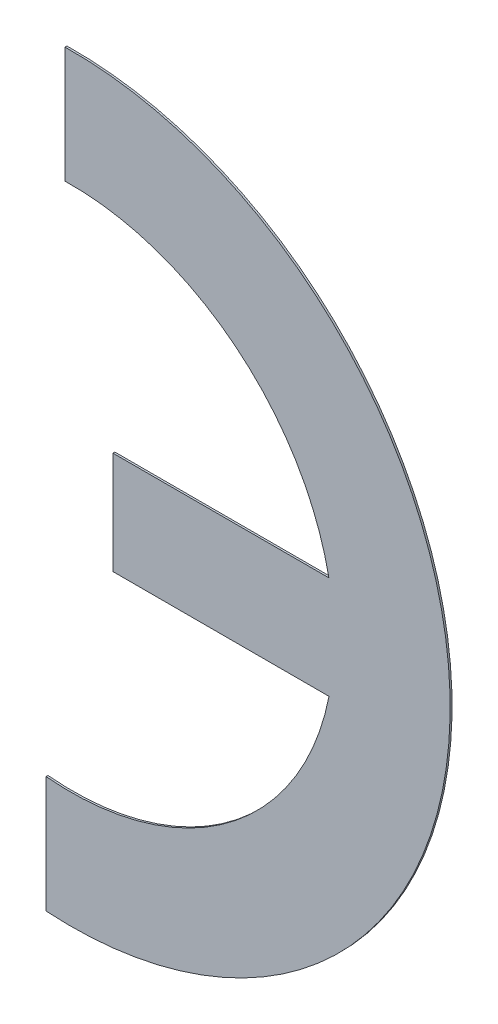
ISO-10303-21;
HEADER;
FILE_DESCRIPTION(('STEP AP214'),'2;1');
FILE_NAME('part.step','',(''),(''),'','','');
FILE_SCHEMA(('AUTOMOTIVE_DESIGN { 1 0 10303 214 1 1 1 1 }'));
ENDSEC;
DATA;
#1=APPLICATION_CONTEXT('core data for automotive mechanical design processes');
#2=APPLICATION_PROTOCOL_DEFINITION('international standard','automotive_design',2000,#1);
#3=PRODUCT_CONTEXT('',#1,'mechanical');
#4=PRODUCT('Part','Part','',(#3));
#5=PRODUCT_RELATED_PRODUCT_CATEGORY('part','',(#4));
#6=PRODUCT_DEFINITION_FORMATION('','',#4);
#7=PRODUCT_DEFINITION_CONTEXT('part definition',#1,'design');
#8=PRODUCT_DEFINITION('design','',#6,#7);
#9=PRODUCT_DEFINITION_SHAPE('','',#8);
#10=(LENGTH_UNIT() NAMED_UNIT(*) SI_UNIT(.MILLI.,.METRE.));
#11=(NAMED_UNIT(*) PLANE_ANGLE_UNIT() SI_UNIT($,.RADIAN.));
#12=(NAMED_UNIT(*) SI_UNIT($,.STERADIAN.) SOLID_ANGLE_UNIT());
#13=UNCERTAINTY_MEASURE_WITH_UNIT(LENGTH_MEASURE(1.E-05),#10,'distance_accuracy_value','');
#14=(GEOMETRIC_REPRESENTATION_CONTEXT(3) GLOBAL_UNCERTAINTY_ASSIGNED_CONTEXT((#13)) GLOBAL_UNIT_ASSIGNED_CONTEXT((#10,
#11,#12)) REPRESENTATION_CONTEXT('',''));
#15=CARTESIAN_POINT('',(0.,0.,0.));
#16=DIRECTION('',(0.,0.,1.));
#17=DIRECTION('',(1.,0.,0.));
#18=AXIS2_PLACEMENT_3D('',#15,#16,#17);
#19=CARTESIAN_POINT('',(2.163636374273,-9.057766507408,0.01));
#20=DIRECTION('',(0.,0.,1.));
#21=DIRECTION('',(1.,0.,0.));
#22=AXIS2_PLACEMENT_3D('',#19,#20,#21);
#23=PLANE('',#22);
#24=DIRECTION('',(0.,-1.,0.));
#25=VECTOR('',#24,1.);
#26=CARTESIAN_POINT('',(1.213927087606,-10.40518749711,0.01));
#27=LINE('',#26,#25);
#28=CARTESIAN_POINT('',(1.213927087606,-10.40518749711,0.01));
#29=VERTEX_POINT('',#28);
#30=CARTESIAN_POINT('',(1.213927087606,-11.01370979213,0.01));
#31=VERTEX_POINT('',#30);
#32=EDGE_CURVE('E257',#29,#31,#27,.T.);
#33=ORIENTED_EDGE('',*,*,#32,.T.);
#34=CARTESIAN_POINT('',(1.343631042744,-9.036814567773,0.01));
#35=DIRECTION('',(0.,0.,1.));
#36=DIRECTION('',(1.,0.,0.));
#37=AXIS2_PLACEMENT_3D('',#34,#35,#36);
#38=CIRCLE('',#37,1.981145588812);
#39=CARTESIAN_POINT('',(1.313241313094,-7.055902073895,0.01));
#40=VERTEX_POINT('',#39);
#41=EDGE_CURVE('E11',#31,#40,#38,.T.);
#42=ORIENTED_EDGE('',*,*,#41,.T.);
#43=DIRECTION('',(0.,1.,0.));
#44=VECTOR('',#43,1.);
#45=CARTESIAN_POINT('',(1.313241313094,-7.662644252979,0.01));
#46=LINE('',#45,#44);
#47=CARTESIAN_POINT('',(1.313241313094,-7.662644252979,0.01));
#48=VERTEX_POINT('',#47);
#49=EDGE_CURVE('E147',#48,#40,#46,.T.);
#50=ORIENTED_EDGE('',*,*,#49,.F.);
#51=CARTESIAN_POINT('',(1.343631042744,-9.036814567773,0.01));
#52=DIRECTION('',(0.,0.,1.));
#53=DIRECTION('',(1.,0.,0.));
#54=AXIS2_PLACEMENT_3D('',#51,#52,#53);
#55=CIRCLE('',#54,1.374506307636);
#56=CARTESIAN_POINT('',(2.691510984447,-8.76758,0.01));
#57=VERTEX_POINT('',#56);
#58=EDGE_CURVE('E114',#57,#48,#55,.T.);
#59=ORIENTED_EDGE('',*,*,#58,.F.);
#60=DIRECTION('',(1.,0.,0.));
#61=VECTOR('',#60,1.);
#62=CARTESIAN_POINT('',(1.562993,-8.76758,0.01));
#63=LINE('',#62,#61);
#64=CARTESIAN_POINT('',(1.562993,-8.76758,0.01));
#65=VERTEX_POINT('',#64);
#66=EDGE_CURVE('E126',#65,#57,#63,.T.);
#67=ORIENTED_EDGE('',*,*,#66,.F.);
#68=DIRECTION('',(0.,1.,0.));
#69=VECTOR('',#68,1.);
#70=CARTESIAN_POINT('',(1.562993,-9.303474464158,0.01));
#71=LINE('',#70,#69);
#72=CARTESIAN_POINT('',(1.562993,-9.303474464158,0.01));
#73=VERTEX_POINT('',#72);
#74=EDGE_CURVE('E129',#73,#65,#71,.T.);
#75=ORIENTED_EDGE('',*,*,#74,.F.);
#76=DIRECTION('',(-1.,0.,0.));
#77=VECTOR('',#76,1.);
#78=CARTESIAN_POINT('',(2.692022710395,-9.303474464158,0.01));
#79=LINE('',#78,#77);
#80=CARTESIAN_POINT('',(2.692022710395,-9.303474464158,0.01));
#81=VERTEX_POINT('',#80);
#82=EDGE_CURVE('E282',#81,#73,#79,.T.);
#83=ORIENTED_EDGE('',*,*,#82,.F.);
#84=CARTESIAN_POINT('',(1.343631042744,-9.036814567773,0.01));
#85=DIRECTION('',(0.,0.,1.));
#86=DIRECTION('',(1.,0.,0.));
#87=AXIS2_PLACEMENT_3D('',#84,#85,#86);
#88=CIRCLE('',#87,1.374506307636);
#89=EDGE_CURVE('E260',#29,#81,#88,.T.);
#90=ORIENTED_EDGE('',*,*,#89,.F.);
#91=EDGE_LOOP('',(#33,#42,#50,#59,#67,#75,#83,#90));
#92=FACE_BOUND('',#91,.T.);
#93=ADVANCED_FACE('F17',(#92),#23,.T.);
#94=CARTESIAN_POINT('',(2.163636374273,-9.057766507408,0.));
#95=DIRECTION('',(0.,0.,1.));
#96=DIRECTION('',(1.,0.,0.));
#97=AXIS2_PLACEMENT_3D('',#94,#95,#96);
#98=PLANE('',#97);
#99=DIRECTION('',(0.,-1.,0.));
#100=VECTOR('',#99,1.);
#101=CARTESIAN_POINT('',(1.213927087606,-10.40518749711,0.));
#102=LINE('',#101,#100);
#103=CARTESIAN_POINT('',(1.213927087606,-10.40518749711,0.));
#104=VERTEX_POINT('',#103);
#105=CARTESIAN_POINT('',(1.213927087606,-11.01370979213,0.));
#106=VERTEX_POINT('',#105);
#107=EDGE_CURVE('E267',#104,#106,#102,.T.);
#108=ORIENTED_EDGE('',*,*,#107,.F.);
#109=CARTESIAN_POINT('',(1.343631042744,-9.036814567773,0.));
#110=DIRECTION('',(0.,0.,1.));
#111=DIRECTION('',(1.,0.,0.));
#112=AXIS2_PLACEMENT_3D('',#109,#110,#111);
#113=CIRCLE('',#112,1.374506307636);
#114=CARTESIAN_POINT('',(2.692022710395,-9.303474464158,0.));
#115=VERTEX_POINT('',#114);
#116=EDGE_CURVE('E279',#104,#115,#113,.T.);
#117=ORIENTED_EDGE('',*,*,#116,.T.);
#118=DIRECTION('',(-1.,0.,0.));
#119=VECTOR('',#118,1.);
#120=CARTESIAN_POINT('',(2.692022710395,-9.303474464158,0.));
#121=LINE('',#120,#119);
#122=CARTESIAN_POINT('',(1.562993,-9.303474464158,0.));
#123=VERTEX_POINT('',#122);
#124=EDGE_CURVE('E121',#115,#123,#121,.T.);
#125=ORIENTED_EDGE('',*,*,#124,.T.);
#126=DIRECTION('',(0.,1.,0.));
#127=VECTOR('',#126,1.);
#128=CARTESIAN_POINT('',(1.562993,-9.303474464158,0.));
#129=LINE('',#128,#127);
#130=CARTESIAN_POINT('',(1.562993,-8.76758,0.));
#131=VERTEX_POINT('',#130);
#132=EDGE_CURVE('E117',#123,#131,#129,.T.);
#133=ORIENTED_EDGE('',*,*,#132,.T.);
#134=DIRECTION('',(1.,0.,0.));
#135=VECTOR('',#134,1.);
#136=CARTESIAN_POINT('',(1.562993,-8.76758,0.));
#137=LINE('',#136,#135);
#138=CARTESIAN_POINT('',(2.691510984447,-8.76758,0.));
#139=VERTEX_POINT('',#138);
#140=EDGE_CURVE('E102',#131,#139,#137,.T.);
#141=ORIENTED_EDGE('',*,*,#140,.T.);
#142=CARTESIAN_POINT('',(1.343631042744,-9.036814567773,0.));
#143=DIRECTION('',(0.,0.,1.));
#144=DIRECTION('',(1.,0.,0.));
#145=AXIS2_PLACEMENT_3D('',#142,#143,#144);
#146=CIRCLE('',#145,1.374506307636);
#147=CARTESIAN_POINT('',(1.313241313094,-7.662644252979,0.));
#148=VERTEX_POINT('',#147);
#149=EDGE_CURVE('E144',#139,#148,#146,.T.);
#150=ORIENTED_EDGE('',*,*,#149,.T.);
#151=DIRECTION('',(0.,1.,0.));
#152=VECTOR('',#151,1.);
#153=CARTESIAN_POINT('',(1.313241313094,-7.662644252979,0.));
#154=LINE('',#153,#152);
#155=CARTESIAN_POINT('',(1.313241313094,-7.055902073895,0.));
#156=VERTEX_POINT('',#155);
#157=EDGE_CURVE('E154',#148,#156,#154,.T.);
#158=ORIENTED_EDGE('',*,*,#157,.T.);
#159=CARTESIAN_POINT('',(1.343631042744,-9.036814567773,0.));
#160=DIRECTION('',(0.,0.,1.));
#161=DIRECTION('',(1.,0.,0.));
#162=AXIS2_PLACEMENT_3D('',#159,#160,#161);
#163=CIRCLE('',#162,1.981145588812);
#164=EDGE_CURVE('E25',#106,#156,#163,.T.);
#165=ORIENTED_EDGE('',*,*,#164,.F.);
#166=EDGE_LOOP('',(#108,#117,#125,#133,#141,#150,#158,#165));
#167=FACE_BOUND('',#166,.T.);
#168=ADVANCED_FACE('F119',(#167),#98,.F.);
#169=CARTESIAN_POINT('',(1.343631042744,-9.036814567773,0.));
#170=DIRECTION('',(0.,0.,-1.));
#171=DIRECTION('',(1.,0.,0.));
#172=AXIS2_PLACEMENT_3D('',#169,#170,#171);
#173=CYLINDRICAL_SURFACE('',#172,1.981145588812);
#174=DIRECTION('',(0.,0.,1.));
#175=VECTOR('',#174,1.);
#176=CARTESIAN_POINT('',(1.213927087606,-11.01370979213,0.));
#177=LINE('',#176,#175);
#178=EDGE_CURVE('E264',#106,#31,#177,.T.);
#179=ORIENTED_EDGE('',*,*,#178,.F.);
#180=ORIENTED_EDGE('',*,*,#164,.T.);
#181=DIRECTION('',(0.,0.,1.));
#182=VECTOR('',#181,1.);
#183=CARTESIAN_POINT('',(1.313241313094,-7.055902073895,0.));
#184=LINE('',#183,#182);
#185=EDGE_CURVE('E151',#156,#40,#184,.T.);
#186=ORIENTED_EDGE('',*,*,#185,.T.);
#187=ORIENTED_EDGE('',*,*,#41,.F.);
#188=EDGE_LOOP('',(#179,#180,#186,#187));
#189=FACE_BOUND('',#188,.T.);
#190=ADVANCED_FACE('F220',(#189),#173,.T.);
#191=CARTESIAN_POINT('',(1.313241313094,-7.662644252979,0.));
#192=DIRECTION('',(-1.,0.,0.));
#193=DIRECTION('',(0.,0.,1.));
#194=AXIS2_PLACEMENT_3D('',#191,#192,#193);
#195=PLANE('',#194);
#196=DIRECTION('',(0.,0.,1.));
#197=VECTOR('',#196,1.);
#198=CARTESIAN_POINT('',(1.313241313094,-7.662644252979,0.));
#199=LINE('',#198,#197);
#200=EDGE_CURVE('E143',#148,#48,#199,.T.);
#201=ORIENTED_EDGE('',*,*,#200,.T.);
#202=ORIENTED_EDGE('',*,*,#49,.T.);
#203=ORIENTED_EDGE('',*,*,#185,.F.);
#204=ORIENTED_EDGE('',*,*,#157,.F.);
#205=EDGE_LOOP('',(#201,#202,#203,#204));
#206=FACE_BOUND('',#205,.T.);
#207=ADVANCED_FACE('F210',(#206),#195,.T.);
#208=CARTESIAN_POINT('',(1.343631042744,-9.036814567773,0.));
#209=DIRECTION('',(0.,0.,-1.));
#210=DIRECTION('',(1.,0.,0.));
#211=AXIS2_PLACEMENT_3D('',#208,#209,#210);
#212=CYLINDRICAL_SURFACE('',#211,1.374506307636);
#213=DIRECTION('',(0.,0.,1.));
#214=VECTOR('',#213,1.);
#215=CARTESIAN_POINT('',(2.691510984447,-8.76758,0.));
#216=LINE('',#215,#214);
#217=EDGE_CURVE('E110',#139,#57,#216,.T.);
#218=ORIENTED_EDGE('',*,*,#217,.T.);
#219=ORIENTED_EDGE('',*,*,#58,.T.);
#220=ORIENTED_EDGE('',*,*,#200,.F.);
#221=ORIENTED_EDGE('',*,*,#149,.F.);
#222=EDGE_LOOP('',(#218,#219,#220,#221));
#223=FACE_BOUND('',#222,.T.);
#224=ADVANCED_FACE('F179',(#223),#212,.F.);
#225=CARTESIAN_POINT('',(1.562993,-8.76758,0.));
#226=DIRECTION('',(0.,1.,0.));
#227=DIRECTION('',(1.,0.,0.));
#228=AXIS2_PLACEMENT_3D('',#225,#226,#227);
#229=PLANE('',#228);
#230=DIRECTION('',(0.,0.,1.));
#231=VECTOR('',#230,1.);
#232=CARTESIAN_POINT('',(1.562993,-8.76758,0.));
#233=LINE('',#232,#231);
#234=EDGE_CURVE('E107',#131,#65,#233,.T.);
#235=ORIENTED_EDGE('',*,*,#234,.T.);
#236=ORIENTED_EDGE('',*,*,#66,.T.);
#237=ORIENTED_EDGE('',*,*,#217,.F.);
#238=ORIENTED_EDGE('',*,*,#140,.F.);
#239=EDGE_LOOP('',(#235,#236,#237,#238));
#240=FACE_BOUND('',#239,.T.);
#241=ADVANCED_FACE('F104',(#240),#229,.T.);
#242=CARTESIAN_POINT('',(1.562993,-9.303474464158,0.));
#243=DIRECTION('',(-1.,0.,0.));
#244=DIRECTION('',(0.,0.,1.));
#245=AXIS2_PLACEMENT_3D('',#242,#243,#244);
#246=PLANE('',#245);
#247=DIRECTION('',(0.,0.,1.));
#248=VECTOR('',#247,1.);
#249=CARTESIAN_POINT('',(1.562993,-9.303474464158,0.));
#250=LINE('',#249,#248);
#251=EDGE_CURVE('E286',#123,#73,#250,.T.);
#252=ORIENTED_EDGE('',*,*,#251,.T.);
#253=ORIENTED_EDGE('',*,*,#74,.T.);
#254=ORIENTED_EDGE('',*,*,#234,.F.);
#255=ORIENTED_EDGE('',*,*,#132,.F.);
#256=EDGE_LOOP('',(#252,#253,#254,#255));
#257=FACE_BOUND('',#256,.T.);
#258=ADVANCED_FACE('F128',(#257),#246,.T.);
#259=CARTESIAN_POINT('',(2.692022710395,-9.303474464158,0.));
#260=DIRECTION('',(0.,-1.,0.));
#261=DIRECTION('',(0.,0.,-1.));
#262=AXIS2_PLACEMENT_3D('',#259,#260,#261);
#263=PLANE('',#262);
#264=DIRECTION('',(0.,0.,1.));
#265=VECTOR('',#264,1.);
#266=CARTESIAN_POINT('',(2.692022710395,-9.303474464158,0.));
#267=LINE('',#266,#265);
#268=EDGE_CURVE('E278',#115,#81,#267,.T.);
#269=ORIENTED_EDGE('',*,*,#268,.T.);
#270=ORIENTED_EDGE('',*,*,#82,.T.);
#271=ORIENTED_EDGE('',*,*,#251,.F.);
#272=ORIENTED_EDGE('',*,*,#124,.F.);
#273=EDGE_LOOP('',(#269,#270,#271,#272));
#274=FACE_BOUND('',#273,.T.);
#275=ADVANCED_FACE('F188',(#274),#263,.T.);
#276=CARTESIAN_POINT('',(1.343631042744,-9.036814567773,0.));
#277=DIRECTION('',(0.,0.,-1.));
#278=DIRECTION('',(1.,0.,0.));
#279=AXIS2_PLACEMENT_3D('',#276,#277,#278);
#280=CYLINDRICAL_SURFACE('',#279,1.374506307636);
#281=DIRECTION('',(0.,0.,1.));
#282=VECTOR('',#281,1.);
#283=CARTESIAN_POINT('',(1.213927087606,-10.40518749711,0.));
#284=LINE('',#283,#282);
#285=EDGE_CURVE('E272',#104,#29,#284,.T.);
#286=ORIENTED_EDGE('',*,*,#285,.T.);
#287=ORIENTED_EDGE('',*,*,#89,.T.);
#288=ORIENTED_EDGE('',*,*,#268,.F.);
#289=ORIENTED_EDGE('',*,*,#116,.F.);
#290=EDGE_LOOP('',(#286,#287,#288,#289));
#291=FACE_BOUND('',#290,.T.);
#292=ADVANCED_FACE('F168',(#291),#280,.F.);
#293=CARTESIAN_POINT('',(1.213927087606,-10.40518749711,0.));
#294=DIRECTION('',(1.,0.,0.));
#295=DIRECTION('',(0.,1.,0.));
#296=AXIS2_PLACEMENT_3D('',#293,#294,#295);
#297=PLANE('',#296);
#298=ORIENTED_EDGE('',*,*,#285,.F.);
#299=ORIENTED_EDGE('',*,*,#107,.T.);
#300=ORIENTED_EDGE('',*,*,#178,.T.);
#301=ORIENTED_EDGE('',*,*,#32,.F.);
#302=EDGE_LOOP('',(#298,#299,#300,#301));
#303=FACE_BOUND('',#302,.T.);
#304=ADVANCED_FACE('F163',(#303),#297,.F.);
#305=CLOSED_SHELL('',(#93,#168,#190,#207,#224,#241,#258,#275,#292,#304));
#306=MANIFOLD_SOLID_BREP('B1',#305);
#307=ADVANCED_BREP_SHAPE_REPRESENTATION('',(#18,#306),#14);
#308=SHAPE_DEFINITION_REPRESENTATION(#9,#307);
ENDSEC;
END-ISO-10303-21;
